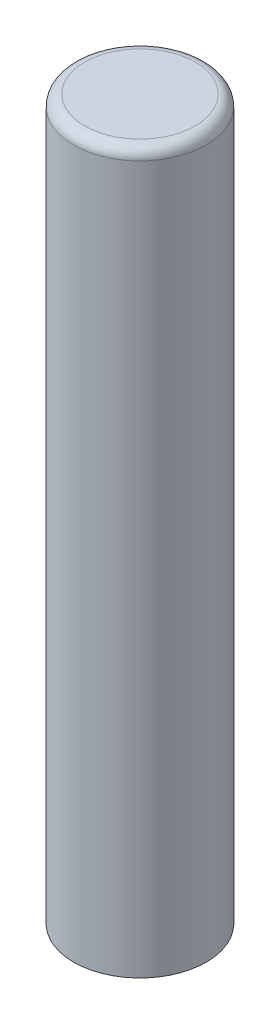
ISO-10303-21;
HEADER;
FILE_DESCRIPTION(('STEP AP214'),'2;1');
FILE_NAME('part.step','',(''),(''),'','','');
FILE_SCHEMA(('AUTOMOTIVE_DESIGN { 1 0 10303 214 1 1 1 1 }'));
ENDSEC;
DATA;
#1=APPLICATION_CONTEXT('core data for automotive mechanical design processes');
#2=APPLICATION_PROTOCOL_DEFINITION('international standard','automotive_design',2000,#1);
#3=PRODUCT_CONTEXT('',#1,'mechanical');
#4=PRODUCT('Part','Part','',(#3));
#5=PRODUCT_RELATED_PRODUCT_CATEGORY('part','',(#4));
#6=PRODUCT_DEFINITION_FORMATION('','',#4);
#7=PRODUCT_DEFINITION_CONTEXT('part definition',#1,'design');
#8=PRODUCT_DEFINITION('design','',#6,#7);
#9=PRODUCT_DEFINITION_SHAPE('','',#8);
#10=(LENGTH_UNIT() NAMED_UNIT(*) SI_UNIT(.MILLI.,.METRE.));
#11=(NAMED_UNIT(*) PLANE_ANGLE_UNIT() SI_UNIT($,.RADIAN.));
#12=(NAMED_UNIT(*) SI_UNIT($,.STERADIAN.) SOLID_ANGLE_UNIT());
#13=UNCERTAINTY_MEASURE_WITH_UNIT(LENGTH_MEASURE(1.E-05),#10,'distance_accuracy_value','');
#14=(GEOMETRIC_REPRESENTATION_CONTEXT(3) GLOBAL_UNCERTAINTY_ASSIGNED_CONTEXT((#13)) GLOBAL_UNIT_ASSIGNED_CONTEXT((#10,
#11,#12)) REPRESENTATION_CONTEXT('',''));
#15=CARTESIAN_POINT('',(0.,0.,0.));
#16=DIRECTION('',(0.,0.,1.));
#17=DIRECTION('',(1.,0.,0.));
#18=AXIS2_PLACEMENT_3D('',#15,#16,#17);
#19=CARTESIAN_POINT('',(0.,650.,0.));
#20=DIRECTION('',(0.,-1.,0.));
#21=DIRECTION('',(0.,0.,-1.));
#22=AXIS2_PLACEMENT_3D('',#19,#20,#21);
#23=CYLINDRICAL_SURFACE('',#22,60.);
#24=CARTESIAN_POINT('',(0.,640.,0.));
#25=DIRECTION('',(0.,1.,0.));
#26=DIRECTION('',(0.,0.,1.));
#27=AXIS2_PLACEMENT_3D('',#24,#25,#26);
#28=CIRCLE('',#27,60.);
#29=CARTESIAN_POINT('',(0.,640.,60.));
#30=VERTEX_POINT('',#29);
#31=EDGE_CURVE('E10',#30,#30,#28,.F.);
#32=ORIENTED_EDGE('',*,*,#31,.T.);
#33=EDGE_LOOP('',(#32));
#34=FACE_BOUND('',#33,.T.);
#35=CARTESIAN_POINT('',(0.,0.,0.));
#36=DIRECTION('',(0.,1.,0.));
#37=DIRECTION('',(0.,0.,1.));
#38=AXIS2_PLACEMENT_3D('',#35,#36,#37);
#39=CIRCLE('',#38,60.);
#40=CARTESIAN_POINT('',(0.,0.,60.));
#41=VERTEX_POINT('',#40);
#42=EDGE_CURVE('E44',#41,#41,#39,.T.);
#43=ORIENTED_EDGE('',*,*,#42,.T.);
#44=EDGE_LOOP('',(#43));
#45=FACE_BOUND('',#44,.T.);
#46=ADVANCED_FACE('F33',(#34,#45),#23,.T.);
#47=CARTESIAN_POINT('',(0.,650.,0.));
#48=DIRECTION('',(0.,1.,0.));
#49=DIRECTION('',(0.,0.,1.));
#50=AXIS2_PLACEMENT_3D('',#47,#48,#49);
#51=PLANE('',#50);
#52=CARTESIAN_POINT('',(0.,650.,0.));
#53=DIRECTION('',(0.,1.,0.));
#54=DIRECTION('',(0.,0.,1.));
#55=AXIS2_PLACEMENT_3D('',#52,#53,#54);
#56=CIRCLE('',#55,50.);
#57=CARTESIAN_POINT('',(0.,650.,50.));
#58=VERTEX_POINT('',#57);
#59=EDGE_CURVE('E40',#58,#58,#56,.T.);
#60=ORIENTED_EDGE('',*,*,#59,.T.);
#61=EDGE_LOOP('',(#60));
#62=FACE_BOUND('',#61,.T.);
#63=ADVANCED_FACE('F54',(#62),#51,.T.);
#64=CARTESIAN_POINT('',(0.,0.,0.));
#65=DIRECTION('',(0.,1.,0.));
#66=DIRECTION('',(0.,0.,1.));
#67=AXIS2_PLACEMENT_3D('',#64,#65,#66);
#68=PLANE('',#67);
#69=ORIENTED_EDGE('',*,*,#42,.F.);
#70=EDGE_LOOP('',(#69));
#71=FACE_BOUND('',#70,.T.);
#72=ADVANCED_FACE('F52',(#71),#68,.F.);
#73=CARTESIAN_POINT('',(0.,640.,0.));
#74=DIRECTION('',(0.,1.,0.));
#75=DIRECTION('',(0.,0.,1.));
#76=AXIS2_PLACEMENT_3D('',#73,#74,#75);
#77=TOROIDAL_SURFACE('',#76,50.,10.);
#78=ORIENTED_EDGE('',*,*,#31,.F.);
#79=EDGE_LOOP('',(#78));
#80=FACE_BOUND('',#79,.T.);
#81=ORIENTED_EDGE('',*,*,#59,.F.);
#82=EDGE_LOOP('',(#81));
#83=FACE_BOUND('',#82,.T.);
#84=ADVANCED_FACE('F35',(#80,#83),#77,.T.);
#85=CLOSED_SHELL('',(#46,#63,#72,#84));
#86=MANIFOLD_SOLID_BREP('B2',#85);
#87=ADVANCED_BREP_SHAPE_REPRESENTATION('',(#18,#86),#14);
#88=SHAPE_DEFINITION_REPRESENTATION(#9,#87);
ENDSEC;
END-ISO-10303-21;
